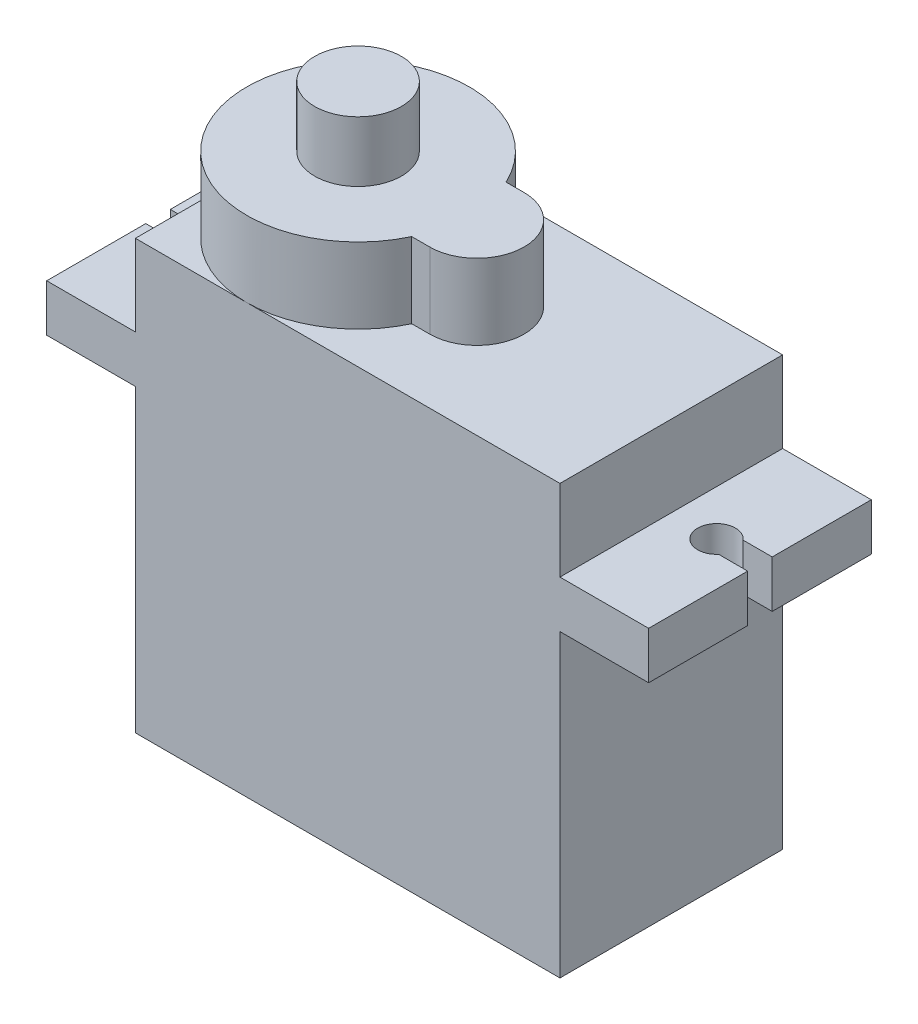
ISO-10303-21;
HEADER;
FILE_DESCRIPTION(('STEP AP214'),'2;1');
FILE_NAME('part.step','',(''),(''),'','','');
FILE_SCHEMA(('AUTOMOTIVE_DESIGN { 1 0 10303 214 1 1 1 1 }'));
ENDSEC;
DATA;
#1=APPLICATION_CONTEXT('core data for automotive mechanical design processes');
#2=APPLICATION_PROTOCOL_DEFINITION('international standard','automotive_design',2000,#1);
#3=PRODUCT_CONTEXT('',#1,'mechanical');
#4=PRODUCT('Part','Part','',(#3));
#5=PRODUCT_RELATED_PRODUCT_CATEGORY('part','',(#4));
#6=PRODUCT_DEFINITION_FORMATION('','',#4);
#7=PRODUCT_DEFINITION_CONTEXT('part definition',#1,'design');
#8=PRODUCT_DEFINITION('design','',#6,#7);
#9=PRODUCT_DEFINITION_SHAPE('','',#8);
#10=(LENGTH_UNIT() NAMED_UNIT(*) SI_UNIT(.MILLI.,.METRE.));
#11=(NAMED_UNIT(*) PLANE_ANGLE_UNIT() SI_UNIT($,.RADIAN.));
#12=(NAMED_UNIT(*) SI_UNIT($,.STERADIAN.) SOLID_ANGLE_UNIT());
#13=UNCERTAINTY_MEASURE_WITH_UNIT(LENGTH_MEASURE(1.E-05),#10,'distance_accuracy_value','');
#14=(GEOMETRIC_REPRESENTATION_CONTEXT(3) GLOBAL_UNCERTAINTY_ASSIGNED_CONTEXT((#13)) GLOBAL_UNIT_ASSIGNED_CONTEXT((#10,
#11,#12)) REPRESENTATION_CONTEXT('',''));
#15=CARTESIAN_POINT('',(0.,0.,0.));
#16=DIRECTION('',(0.,0.,1.));
#17=DIRECTION('',(1.,0.,0.));
#18=AXIS2_PLACEMENT_3D('',#15,#16,#17);
#19=CARTESIAN_POINT('',(0.95,26.7,5.9));
#20=DIRECTION('',(0.,1.,0.));
#21=DIRECTION('',(-1.,0.,0.));
#22=AXIS2_PLACEMENT_3D('',#19,#20,#21);
#23=PLANE('',#22);
#24=CARTESIAN_POINT('',(0.95,26.7,5.9));
#25=DIRECTION('',(0.,1.,0.));
#26=DIRECTION('',(-1.,0.,0.));
#27=AXIS2_PLACEMENT_3D('',#24,#25,#26);
#28=CIRCLE('',#27,2.5);
#29=CARTESIAN_POINT('',(0.949999999999993,26.7,8.4));
#30=VERTEX_POINT('',#29);
#31=CARTESIAN_POINT('',(0.95,26.7,3.4));
#32=VERTEX_POINT('',#31);
#33=EDGE_CURVE('E250',#30,#32,#28,.T.);
#34=ORIENTED_EDGE('',*,*,#33,.T.);
#35=DIRECTION('',(-1.,0.,0.));
#36=VECTOR('',#35,1.);
#37=CARTESIAN_POINT('',(0.95,26.7,3.4));
#38=LINE('',#37,#36);
#39=CARTESIAN_POINT('',(-0.00584431364504856,26.7,3.40000000000001));
#40=VERTEX_POINT('',#39);
#41=EDGE_CURVE('E253',#32,#40,#38,.T.);
#42=ORIENTED_EDGE('',*,*,#41,.T.);
#43=CARTESIAN_POINT('',(-5.35,26.7,5.9));
#44=DIRECTION('',(0.,1.,0.));
#45=DIRECTION('',(-1.,0.,0.));
#46=AXIS2_PLACEMENT_3D('',#43,#44,#45);
#47=CIRCLE('',#46,5.9);
#48=CARTESIAN_POINT('',(-0.00584431364505206,26.7,8.4));
#49=VERTEX_POINT('',#48);
#50=EDGE_CURVE('E256',#40,#49,#47,.T.);
#51=ORIENTED_EDGE('',*,*,#50,.T.);
#52=DIRECTION('',(1.,0.,0.));
#53=VECTOR('',#52,1.);
#54=CARTESIAN_POINT('',(0.949999999999993,26.7,8.4));
#55=LINE('',#54,#53);
#56=EDGE_CURVE('E258',#49,#30,#55,.T.);
#57=ORIENTED_EDGE('',*,*,#56,.T.);
#58=EDGE_LOOP('',(#34,#42,#51,#57));
#59=FACE_BOUND('',#58,.T.);
#60=CARTESIAN_POINT('',(-5.35,26.7,5.9));
#61=DIRECTION('',(0.,1.,0.));
#62=DIRECTION('',(-1.,0.,0.));
#63=AXIS2_PLACEMENT_3D('',#60,#61,#62);
#64=CIRCLE('',#63,2.3);
#65=CARTESIAN_POINT('',(-7.65,26.7,5.9));
#66=VERTEX_POINT('',#65);
#67=EDGE_CURVE('E405',#66,#66,#64,.T.);
#68=ORIENTED_EDGE('',*,*,#67,.F.);
#69=EDGE_LOOP('',(#68));
#70=FACE_BOUND('',#69,.T.);
#71=ADVANCED_FACE('F37',(#59,#70),#23,.T.);
#72=CARTESIAN_POINT('',(15.95,15.9,11.8));
#73=DIRECTION('',(-1.,0.,0.));
#74=DIRECTION('',(0.,-1.,0.));
#75=AXIS2_PLACEMENT_3D('',#72,#73,#74);
#76=PLANE('',#75);
#77=DIRECTION('',(0.,0.,-1.));
#78=VECTOR('',#77,1.);
#79=CARTESIAN_POINT('',(15.95,18.4,11.8));
#80=LINE('',#79,#78);
#81=CARTESIAN_POINT('',(15.95,18.4,5.25));
#82=VERTEX_POINT('',#81);
#83=CARTESIAN_POINT('',(15.95,18.4,0.));
#84=VERTEX_POINT('',#83);
#85=EDGE_CURVE('E372',#82,#84,#80,.T.);
#86=ORIENTED_EDGE('',*,*,#85,.F.);
#87=DIRECTION('',(0.,1.,0.));
#88=VECTOR('',#87,1.);
#89=CARTESIAN_POINT('',(15.95,0.,5.25));
#90=LINE('',#89,#88);
#91=CARTESIAN_POINT('',(15.95,15.9,5.25));
#92=VERTEX_POINT('',#91);
#93=EDGE_CURVE('E400',#92,#82,#90,.T.);
#94=ORIENTED_EDGE('',*,*,#93,.F.);
#95=DIRECTION('',(0.,0.,-1.));
#96=VECTOR('',#95,1.);
#97=CARTESIAN_POINT('',(15.95,15.9,11.8));
#98=LINE('',#97,#96);
#99=CARTESIAN_POINT('',(15.95,15.9,0.));
#100=VERTEX_POINT('',#99);
#101=EDGE_CURVE('E376',#92,#100,#98,.T.);
#102=ORIENTED_EDGE('',*,*,#101,.T.);
#103=DIRECTION('',(0.,1.,0.));
#104=VECTOR('',#103,1.);
#105=CARTESIAN_POINT('',(15.95,15.9,0.));
#106=LINE('',#105,#104);
#107=EDGE_CURVE('E319',#100,#84,#106,.T.);
#108=ORIENTED_EDGE('',*,*,#107,.T.);
#109=EDGE_LOOP('',(#86,#94,#102,#108));
#110=FACE_BOUND('',#109,.T.);
#111=ADVANCED_FACE('F420',(#110),#76,.F.);
#112=CARTESIAN_POINT('',(-15.95,15.9,11.8));
#113=DIRECTION('',(1.,0.,0.));
#114=DIRECTION('',(0.,1.,0.));
#115=AXIS2_PLACEMENT_3D('',#112,#113,#114);
#116=PLANE('',#115);
#117=DIRECTION('',(0.,0.,-1.));
#118=VECTOR('',#117,1.);
#119=CARTESIAN_POINT('',(-15.95,15.9,11.8));
#120=LINE('',#119,#118);
#121=CARTESIAN_POINT('',(-15.95,15.9,5.25000000000001));
#122=VERTEX_POINT('',#121);
#123=CARTESIAN_POINT('',(-15.95,15.9,0.));
#124=VERTEX_POINT('',#123);
#125=EDGE_CURVE('E351',#122,#124,#120,.T.);
#126=ORIENTED_EDGE('',*,*,#125,.F.);
#127=DIRECTION('',(0.,1.,0.));
#128=VECTOR('',#127,1.);
#129=CARTESIAN_POINT('',(-15.95,0.,5.25000000000001));
#130=LINE('',#129,#128);
#131=CARTESIAN_POINT('',(-15.95,18.4,5.25000000000001));
#132=VERTEX_POINT('',#131);
#133=EDGE_CURVE('E233',#122,#132,#130,.T.);
#134=ORIENTED_EDGE('',*,*,#133,.T.);
#135=DIRECTION('',(0.,0.,-1.));
#136=VECTOR('',#135,1.);
#137=CARTESIAN_POINT('',(-15.95,18.4,11.8));
#138=LINE('',#137,#136);
#139=CARTESIAN_POINT('',(-15.95,18.4,0.));
#140=VERTEX_POINT('',#139);
#141=EDGE_CURVE('E355',#132,#140,#138,.T.);
#142=ORIENTED_EDGE('',*,*,#141,.T.);
#143=DIRECTION('',(0.,-1.,0.));
#144=VECTOR('',#143,1.);
#145=CARTESIAN_POINT('',(-15.95,15.9,0.));
#146=LINE('',#145,#144);
#147=EDGE_CURVE('E335',#140,#124,#146,.T.);
#148=ORIENTED_EDGE('',*,*,#147,.T.);
#149=EDGE_LOOP('',(#126,#134,#142,#148));
#150=FACE_BOUND('',#149,.T.);
#151=ADVANCED_FACE('F426',(#150),#116,.F.);
#152=CARTESIAN_POINT('',(11.25,22.7,11.8));
#153=DIRECTION('',(0.,-1.,0.));
#154=DIRECTION('',(1.,0.,0.));
#155=AXIS2_PLACEMENT_3D('',#152,#153,#154);
#156=PLANE('',#155);
#157=CARTESIAN_POINT('',(-5.35,22.7,5.9));
#158=DIRECTION('',(0.,1.,0.));
#159=DIRECTION('',(-1.,0.,0.));
#160=AXIS2_PLACEMENT_3D('',#157,#158,#159);
#161=CIRCLE('',#160,5.9);
#162=CARTESIAN_POINT('',(-11.25,22.7,5.9));
#163=VERTEX_POINT('',#162);
#164=CARTESIAN_POINT('',(-5.35,22.7,11.8));
#165=VERTEX_POINT('',#164);
#166=EDGE_CURVE('E269',#163,#165,#161,.T.);
#167=ORIENTED_EDGE('',*,*,#166,.F.);
#168=DIRECTION('',(0.,0.,-1.));
#169=VECTOR('',#168,1.);
#170=CARTESIAN_POINT('',(-11.25,22.7,11.8));
#171=LINE('',#170,#169);
#172=CARTESIAN_POINT('',(-11.25,22.7,11.8));
#173=VERTEX_POINT('',#172);
#174=EDGE_CURVE('E363',#173,#163,#171,.T.);
#175=ORIENTED_EDGE('',*,*,#174,.F.);
#176=DIRECTION('',(-1.,0.,0.));
#177=VECTOR('',#176,1.);
#178=CARTESIAN_POINT('',(11.25,22.7,11.8));
#179=LINE('',#178,#177);
#180=EDGE_CURVE('E297',#165,#173,#179,.T.);
#181=ORIENTED_EDGE('',*,*,#180,.F.);
#182=EDGE_LOOP('',(#167,#175,#181));
#183=FACE_BOUND('',#182,.T.);
#184=ADVANCED_FACE('F483',(#183),#156,.F.);
#185=CARTESIAN_POINT('',(-0.00584431364505144,22.7,8.4));
#186=VERTEX_POINT('',#185);
#187=EDGE_CURVE('E533',#165,#186,#161,.T.);
#188=ORIENTED_EDGE('',*,*,#187,.F.);
#189=CARTESIAN_POINT('',(11.25,22.7,11.8));
#190=VERTEX_POINT('',#189);
#191=EDGE_CURVE('E298',#190,#165,#179,.T.);
#192=ORIENTED_EDGE('',*,*,#191,.F.);
#193=DIRECTION('',(0.,0.,-1.));
#194=VECTOR('',#193,1.);
#195=CARTESIAN_POINT('',(11.25,22.7,11.8));
#196=LINE('',#195,#194);
#197=CARTESIAN_POINT('',(11.25,22.7,0.));
#198=VERTEX_POINT('',#197);
#199=EDGE_CURVE('E366',#190,#198,#196,.T.);
#200=ORIENTED_EDGE('',*,*,#199,.T.);
#201=DIRECTION('',(-1.,0.,0.));
#202=VECTOR('',#201,1.);
#203=CARTESIAN_POINT('',(11.25,22.7,0.));
#204=LINE('',#203,#202);
#205=CARTESIAN_POINT('',(-5.35,22.7,0.));
#206=VERTEX_POINT('',#205);
#207=EDGE_CURVE('E327',#198,#206,#204,.T.);
#208=ORIENTED_EDGE('',*,*,#207,.T.);
#209=CARTESIAN_POINT('',(-0.00584431364504794,22.7,3.40000000000001));
#210=VERTEX_POINT('',#209);
#211=EDGE_CURVE('E266',#210,#206,#161,.T.);
#212=ORIENTED_EDGE('',*,*,#211,.F.);
#213=DIRECTION('',(-1.,0.,0.));
#214=VECTOR('',#213,1.);
#215=CARTESIAN_POINT('',(0.95,22.7,3.4));
#216=LINE('',#215,#214);
#217=CARTESIAN_POINT('',(0.95,22.7,3.4));
#218=VERTEX_POINT('',#217);
#219=EDGE_CURVE('E263',#218,#210,#216,.T.);
#220=ORIENTED_EDGE('',*,*,#219,.F.);
#221=CARTESIAN_POINT('',(0.95,22.7,5.9));
#222=DIRECTION('',(0.,1.,0.));
#223=DIRECTION('',(-1.,0.,0.));
#224=AXIS2_PLACEMENT_3D('',#221,#222,#223);
#225=CIRCLE('',#224,2.5);
#226=CARTESIAN_POINT('',(0.949999999999993,22.7,8.4));
#227=VERTEX_POINT('',#226);
#228=EDGE_CURVE('E249',#227,#218,#225,.T.);
#229=ORIENTED_EDGE('',*,*,#228,.F.);
#230=DIRECTION('',(1.,0.,0.));
#231=VECTOR('',#230,1.);
#232=CARTESIAN_POINT('',(0.949999999999993,22.7,8.4));
#233=LINE('',#232,#231);
#234=EDGE_CURVE('E254',#186,#227,#233,.T.);
#235=ORIENTED_EDGE('',*,*,#234,.F.);
#236=EDGE_LOOP('',(#188,#192,#200,#208,#212,#220,#229,#235));
#237=FACE_BOUND('',#236,.T.);
#238=ADVANCED_FACE('F486',(#237),#156,.F.);
#239=EDGE_CURVE('E270',#206,#163,#161,.T.);
#240=ORIENTED_EDGE('',*,*,#239,.F.);
#241=CARTESIAN_POINT('',(-11.25,22.7,0.));
#242=VERTEX_POINT('',#241);
#243=EDGE_CURVE('E326',#206,#242,#204,.T.);
#244=ORIENTED_EDGE('',*,*,#243,.T.);
#245=EDGE_CURVE('E362',#163,#242,#171,.T.);
#246=ORIENTED_EDGE('',*,*,#245,.F.);
#247=EDGE_LOOP('',(#240,#244,#246));
#248=FACE_BOUND('',#247,.T.);
#249=ADVANCED_FACE('F488',(#248),#156,.F.);
#250=CARTESIAN_POINT('',(11.25,0.,11.8));
#251=DIRECTION('',(-1.,0.,0.));
#252=DIRECTION('',(0.,0.,1.));
#253=AXIS2_PLACEMENT_3D('',#250,#251,#252);
#254=PLANE('',#253);
#255=DIRECTION('',(0.,1.,0.));
#256=VECTOR('',#255,1.);
#257=CARTESIAN_POINT('',(11.25,0.,0.));
#258=LINE('',#257,#256);
#259=CARTESIAN_POINT('',(11.25,0.,0.));
#260=VERTEX_POINT('',#259);
#261=CARTESIAN_POINT('',(11.25,15.9,0.));
#262=VERTEX_POINT('',#261);
#263=EDGE_CURVE('E284',#260,#262,#258,.T.);
#264=ORIENTED_EDGE('',*,*,#263,.T.);
#265=DIRECTION('',(0.,0.,-1.));
#266=VECTOR('',#265,1.);
#267=CARTESIAN_POINT('',(11.25,15.9,11.8));
#268=LINE('',#267,#266);
#269=CARTESIAN_POINT('',(11.25,15.9,11.8));
#270=VERTEX_POINT('',#269);
#271=EDGE_CURVE('E379',#270,#262,#268,.T.);
#272=ORIENTED_EDGE('',*,*,#271,.F.);
#273=DIRECTION('',(0.,1.,0.));
#274=VECTOR('',#273,1.);
#275=CARTESIAN_POINT('',(11.25,0.,11.8));
#276=LINE('',#275,#274);
#277=CARTESIAN_POINT('',(11.25,0.,11.8));
#278=VERTEX_POINT('',#277);
#279=EDGE_CURVE('E285',#278,#270,#276,.T.);
#280=ORIENTED_EDGE('',*,*,#279,.F.);
#281=DIRECTION('',(0.,0.,-1.));
#282=VECTOR('',#281,1.);
#283=CARTESIAN_POINT('',(11.25,0.,11.8));
#284=LINE('',#283,#282);
#285=EDGE_CURVE('E313',#278,#260,#284,.T.);
#286=ORIENTED_EDGE('',*,*,#285,.T.);
#287=EDGE_LOOP('',(#264,#272,#280,#286));
#288=FACE_BOUND('',#287,.T.);
#289=ADVANCED_FACE('F39',(#288),#254,.F.);
#290=CARTESIAN_POINT('',(11.25,15.9,11.8));
#291=DIRECTION('',(0.,1.,0.));
#292=DIRECTION('',(0.,0.,1.));
#293=AXIS2_PLACEMENT_3D('',#290,#291,#292);
#294=PLANE('',#293);
#295=ORIENTED_EDGE('',*,*,#101,.F.);
#296=DIRECTION('',(-1.,0.,0.));
#297=VECTOR('',#296,1.);
#298=CARTESIAN_POINT('',(11.25,15.9,5.25000000000001));
#299=LINE('',#298,#297);
#300=CARTESIAN_POINT('',(14.4099342076785,15.9,5.25));
#301=VERTEX_POINT('',#300);
#302=EDGE_CURVE('E213',#92,#301,#299,.T.);
#303=ORIENTED_EDGE('',*,*,#302,.T.);
#304=CARTESIAN_POINT('',(13.65,15.9,5.9));
#305=DIRECTION('',(0.,1.,0.));
#306=DIRECTION('',(0.,0.,1.));
#307=AXIS2_PLACEMENT_3D('',#304,#305,#306);
#308=CIRCLE('',#307,0.999999999999998);
#309=CARTESIAN_POINT('',(14.4099342076785,15.9,6.55));
#310=VERTEX_POINT('',#309);
#311=EDGE_CURVE('E219',#301,#310,#308,.T.);
#312=ORIENTED_EDGE('',*,*,#311,.T.);
#313=DIRECTION('',(1.,0.,0.));
#314=VECTOR('',#313,1.);
#315=CARTESIAN_POINT('',(11.25,15.9,6.55));
#316=LINE('',#315,#314);
#317=CARTESIAN_POINT('',(15.95,15.9,6.55));
#318=VERTEX_POINT('',#317);
#319=EDGE_CURVE('E205',#310,#318,#316,.T.);
#320=ORIENTED_EDGE('',*,*,#319,.T.);
#321=CARTESIAN_POINT('',(15.95,15.9,11.8));
#322=VERTEX_POINT('',#321);
#323=EDGE_CURVE('E377',#322,#318,#98,.T.);
#324=ORIENTED_EDGE('',*,*,#323,.F.);
#325=DIRECTION('',(1.,0.,0.));
#326=VECTOR('',#325,1.);
#327=CARTESIAN_POINT('',(11.25,15.9,11.8));
#328=LINE('',#327,#326);
#329=EDGE_CURVE('E288',#270,#322,#328,.T.);
#330=ORIENTED_EDGE('',*,*,#329,.F.);
#331=ORIENTED_EDGE('',*,*,#271,.T.);
#332=DIRECTION('',(1.,0.,0.));
#333=VECTOR('',#332,1.);
#334=CARTESIAN_POINT('',(11.25,15.9,0.));
#335=LINE('',#334,#333);
#336=EDGE_CURVE('E316',#262,#100,#335,.T.);
#337=ORIENTED_EDGE('',*,*,#336,.T.);
#338=EDGE_LOOP('',(#295,#303,#312,#320,#324,#330,#331,#337));
#339=FACE_BOUND('',#338,.T.);
#340=ADVANCED_FACE('F227',(#339),#294,.F.);
#341=ORIENTED_EDGE('',*,*,#323,.T.);
#342=DIRECTION('',(0.,1.,0.));
#343=VECTOR('',#342,1.);
#344=CARTESIAN_POINT('',(15.95,0.,6.55));
#345=LINE('',#344,#343);
#346=CARTESIAN_POINT('',(15.95,18.4,6.55));
#347=VERTEX_POINT('',#346);
#348=EDGE_CURVE('E208',#318,#347,#345,.T.);
#349=ORIENTED_EDGE('',*,*,#348,.T.);
#350=CARTESIAN_POINT('',(15.95,18.4,11.8));
#351=VERTEX_POINT('',#350);
#352=EDGE_CURVE('E373',#351,#347,#80,.T.);
#353=ORIENTED_EDGE('',*,*,#352,.F.);
#354=DIRECTION('',(0.,1.,0.));
#355=VECTOR('',#354,1.);
#356=CARTESIAN_POINT('',(15.95,15.9,11.8));
#357=LINE('',#356,#355);
#358=EDGE_CURVE('E291',#322,#351,#357,.T.);
#359=ORIENTED_EDGE('',*,*,#358,.F.);
#360=EDGE_LOOP('',(#341,#349,#353,#359));
#361=FACE_BOUND('',#360,.T.);
#362=ADVANCED_FACE('F398',(#361),#76,.F.);
#363=CARTESIAN_POINT('',(15.95,18.4,11.8));
#364=DIRECTION('',(0.,-1.,0.));
#365=DIRECTION('',(0.,0.,-1.));
#366=AXIS2_PLACEMENT_3D('',#363,#364,#365);
#367=PLANE('',#366);
#368=CARTESIAN_POINT('',(13.65,18.4,5.9));
#369=DIRECTION('',(0.,-1.,0.));
#370=DIRECTION('',(0.,0.,-1.));
#371=AXIS2_PLACEMENT_3D('',#368,#369,#370);
#372=CIRCLE('',#371,0.999999999999998);
#373=CARTESIAN_POINT('',(14.4099342076785,18.4,6.55));
#374=VERTEX_POINT('',#373);
#375=CARTESIAN_POINT('',(14.4099342076785,18.4,5.25));
#376=VERTEX_POINT('',#375);
#377=EDGE_CURVE('E45',#374,#376,#372,.T.);
#378=ORIENTED_EDGE('',*,*,#377,.T.);
#379=DIRECTION('',(1.,0.,0.));
#380=VECTOR('',#379,1.);
#381=CARTESIAN_POINT('',(15.95,18.4,5.25));
#382=LINE('',#381,#380);
#383=EDGE_CURVE('E11',#376,#82,#382,.T.);
#384=ORIENTED_EDGE('',*,*,#383,.T.);
#385=ORIENTED_EDGE('',*,*,#85,.T.);
#386=DIRECTION('',(-1.,0.,0.));
#387=VECTOR('',#386,1.);
#388=CARTESIAN_POINT('',(15.95,18.4,0.));
#389=LINE('',#388,#387);
#390=CARTESIAN_POINT('',(11.25,18.4,0.));
#391=VERTEX_POINT('',#390);
#392=EDGE_CURVE('E322',#84,#391,#389,.T.);
#393=ORIENTED_EDGE('',*,*,#392,.T.);
#394=DIRECTION('',(0.,0.,-1.));
#395=VECTOR('',#394,1.);
#396=CARTESIAN_POINT('',(11.25,18.4,11.8));
#397=LINE('',#396,#395);
#398=CARTESIAN_POINT('',(11.25,18.4,11.8));
#399=VERTEX_POINT('',#398);
#400=EDGE_CURVE('E369',#399,#391,#397,.T.);
#401=ORIENTED_EDGE('',*,*,#400,.F.);
#402=DIRECTION('',(-1.,0.,0.));
#403=VECTOR('',#402,1.);
#404=CARTESIAN_POINT('',(15.95,18.4,11.8));
#405=LINE('',#404,#403);
#406=EDGE_CURVE('E293',#351,#399,#405,.T.);
#407=ORIENTED_EDGE('',*,*,#406,.F.);
#408=ORIENTED_EDGE('',*,*,#352,.T.);
#409=DIRECTION('',(-1.,0.,0.));
#410=VECTOR('',#409,1.);
#411=CARTESIAN_POINT('',(15.95,18.4,6.55));
#412=LINE('',#411,#410);
#413=EDGE_CURVE('E391',#347,#374,#412,.T.);
#414=ORIENTED_EDGE('',*,*,#413,.T.);
#415=EDGE_LOOP('',(#378,#384,#385,#393,#401,#407,#408,#414));
#416=FACE_BOUND('',#415,.T.);
#417=ADVANCED_FACE('F393',(#416),#367,.F.);
#418=CARTESIAN_POINT('',(11.25,18.4,11.8));
#419=DIRECTION('',(-1.,0.,0.));
#420=DIRECTION('',(0.,-1.,0.));
#421=AXIS2_PLACEMENT_3D('',#418,#419,#420);
#422=PLANE('',#421);
#423=DIRECTION('',(0.,1.,0.));
#424=VECTOR('',#423,1.);
#425=CARTESIAN_POINT('',(11.25,18.4,0.));
#426=LINE('',#425,#424);
#427=EDGE_CURVE('E324',#391,#198,#426,.T.);
#428=ORIENTED_EDGE('',*,*,#427,.T.);
#429=ORIENTED_EDGE('',*,*,#199,.F.);
#430=DIRECTION('',(0.,1.,0.));
#431=VECTOR('',#430,1.);
#432=CARTESIAN_POINT('',(11.25,18.4,11.8));
#433=LINE('',#432,#431);
#434=EDGE_CURVE('E295',#399,#190,#433,.T.);
#435=ORIENTED_EDGE('',*,*,#434,.F.);
#436=ORIENTED_EDGE('',*,*,#400,.T.);
#437=EDGE_LOOP('',(#428,#429,#435,#436));
#438=FACE_BOUND('',#437,.T.);
#439=ADVANCED_FACE('F481',(#438),#422,.F.);
#440=CARTESIAN_POINT('',(-11.25,18.4,11.8));
#441=DIRECTION('',(1.,0.,0.));
#442=DIRECTION('',(0.,1.,0.));
#443=AXIS2_PLACEMENT_3D('',#440,#441,#442);
#444=PLANE('',#443);
#445=DIRECTION('',(0.,-1.,0.));
#446=VECTOR('',#445,1.);
#447=CARTESIAN_POINT('',(-11.25,18.4,0.));
#448=LINE('',#447,#446);
#449=CARTESIAN_POINT('',(-11.25,18.4,0.));
#450=VERTEX_POINT('',#449);
#451=EDGE_CURVE('E330',#242,#450,#448,.T.);
#452=ORIENTED_EDGE('',*,*,#451,.T.);
#453=DIRECTION('',(0.,0.,-1.));
#454=VECTOR('',#453,1.);
#455=CARTESIAN_POINT('',(-11.25,18.4,11.8));
#456=LINE('',#455,#454);
#457=CARTESIAN_POINT('',(-11.25,18.4,11.8));
#458=VERTEX_POINT('',#457);
#459=EDGE_CURVE('E359',#458,#450,#456,.T.);
#460=ORIENTED_EDGE('',*,*,#459,.F.);
#461=DIRECTION('',(0.,-1.,0.));
#462=VECTOR('',#461,1.);
#463=CARTESIAN_POINT('',(-11.25,18.4,11.8));
#464=LINE('',#463,#462);
#465=EDGE_CURVE('E301',#173,#458,#464,.T.);
#466=ORIENTED_EDGE('',*,*,#465,.F.);
#467=ORIENTED_EDGE('',*,*,#174,.T.);
#468=ORIENTED_EDGE('',*,*,#245,.T.);
#469=EDGE_LOOP('',(#452,#460,#466,#467,#468));
#470=FACE_BOUND('',#469,.T.);
#471=ADVANCED_FACE('F477',(#470),#444,.F.);
#472=CARTESIAN_POINT('',(-15.95,18.4,11.8));
#473=DIRECTION('',(0.,-1.,0.));
#474=DIRECTION('',(0.,0.,-1.));
#475=AXIS2_PLACEMENT_3D('',#472,#473,#474);
#476=PLANE('',#475);
#477=ORIENTED_EDGE('',*,*,#141,.F.);
#478=DIRECTION('',(1.,0.,0.));
#479=VECTOR('',#478,1.);
#480=CARTESIAN_POINT('',(-15.95,18.4,5.25000000000001));
#481=LINE('',#480,#479);
#482=CARTESIAN_POINT('',(-14.4099342076785,18.4,5.25000000000001));
#483=VERTEX_POINT('',#482);
#484=EDGE_CURVE('E246',#132,#483,#481,.T.);
#485=ORIENTED_EDGE('',*,*,#484,.T.);
#486=CARTESIAN_POINT('',(-13.65,18.4,5.9));
#487=DIRECTION('',(0.,-1.,0.));
#488=DIRECTION('',(0.,0.,-1.));
#489=AXIS2_PLACEMENT_3D('',#486,#487,#488);
#490=CIRCLE('',#489,0.999999999999999);
#491=CARTESIAN_POINT('',(-14.4099342076785,18.4,6.55));
#492=VERTEX_POINT('',#491);
#493=EDGE_CURVE('E243',#483,#492,#490,.T.);
#494=ORIENTED_EDGE('',*,*,#493,.T.);
#495=DIRECTION('',(-1.,0.,0.));
#496=VECTOR('',#495,1.);
#497=CARTESIAN_POINT('',(-15.95,18.4,6.55));
#498=LINE('',#497,#496);
#499=CARTESIAN_POINT('',(-15.95,18.4,6.55));
#500=VERTEX_POINT('',#499);
#501=EDGE_CURVE('E236',#492,#500,#498,.T.);
#502=ORIENTED_EDGE('',*,*,#501,.T.);
#503=CARTESIAN_POINT('',(-15.95,18.4,11.8));
#504=VERTEX_POINT('',#503);
#505=EDGE_CURVE('E356',#504,#500,#138,.T.);
#506=ORIENTED_EDGE('',*,*,#505,.F.);
#507=DIRECTION('',(-1.,0.,0.));
#508=VECTOR('',#507,1.);
#509=CARTESIAN_POINT('',(-15.95,18.4,11.8));
#510=LINE('',#509,#508);
#511=EDGE_CURVE('E303',#458,#504,#510,.T.);
#512=ORIENTED_EDGE('',*,*,#511,.F.);
#513=ORIENTED_EDGE('',*,*,#459,.T.);
#514=DIRECTION('',(-1.,0.,0.));
#515=VECTOR('',#514,1.);
#516=CARTESIAN_POINT('',(-15.95,18.4,0.));
#517=LINE('',#516,#515);
#518=EDGE_CURVE('E332',#450,#140,#517,.T.);
#519=ORIENTED_EDGE('',*,*,#518,.T.);
#520=EDGE_LOOP('',(#477,#485,#494,#502,#506,#512,#513,#519));
#521=FACE_BOUND('',#520,.T.);
#522=ADVANCED_FACE('F473',(#521),#476,.F.);
#523=ORIENTED_EDGE('',*,*,#505,.T.);
#524=DIRECTION('',(0.,1.,0.));
#525=VECTOR('',#524,1.);
#526=CARTESIAN_POINT('',(-15.95,0.,6.55));
#527=LINE('',#526,#525);
#528=CARTESIAN_POINT('',(-15.95,15.9,6.55));
#529=VERTEX_POINT('',#528);
#530=EDGE_CURVE('E228',#529,#500,#527,.T.);
#531=ORIENTED_EDGE('',*,*,#530,.F.);
#532=CARTESIAN_POINT('',(-15.95,15.9,11.8));
#533=VERTEX_POINT('',#532);
#534=EDGE_CURVE('E352',#533,#529,#120,.T.);
#535=ORIENTED_EDGE('',*,*,#534,.F.);
#536=DIRECTION('',(0.,-1.,0.));
#537=VECTOR('',#536,1.);
#538=CARTESIAN_POINT('',(-15.95,15.9,11.8));
#539=LINE('',#538,#537);
#540=EDGE_CURVE('E305',#504,#533,#539,.T.);
#541=ORIENTED_EDGE('',*,*,#540,.F.);
#542=EDGE_LOOP('',(#523,#531,#535,#541));
#543=FACE_BOUND('',#542,.T.);
#544=ADVANCED_FACE('F469',(#543),#116,.F.);
#545=CARTESIAN_POINT('',(-11.25,15.9,11.8));
#546=DIRECTION('',(0.,1.,0.));
#547=DIRECTION('',(0.,0.,1.));
#548=AXIS2_PLACEMENT_3D('',#545,#546,#547);
#549=PLANE('',#548);
#550=CARTESIAN_POINT('',(-13.65,15.9,5.9));
#551=DIRECTION('',(0.,1.,0.));
#552=DIRECTION('',(0.,0.,1.));
#553=AXIS2_PLACEMENT_3D('',#550,#551,#552);
#554=CIRCLE('',#553,0.999999999999999);
#555=CARTESIAN_POINT('',(-14.4099342076785,15.9,6.55));
#556=VERTEX_POINT('',#555);
#557=CARTESIAN_POINT('',(-14.4099342076785,15.9,5.25000000000001));
#558=VERTEX_POINT('',#557);
#559=EDGE_CURVE('E385',#556,#558,#554,.T.);
#560=ORIENTED_EDGE('',*,*,#559,.T.);
#561=DIRECTION('',(-1.,0.,0.));
#562=VECTOR('',#561,1.);
#563=CARTESIAN_POINT('',(-11.25,15.9,5.25000000000001));
#564=LINE('',#563,#562);
#565=EDGE_CURVE('E388',#558,#122,#564,.T.);
#566=ORIENTED_EDGE('',*,*,#565,.T.);
#567=ORIENTED_EDGE('',*,*,#125,.T.);
#568=DIRECTION('',(1.,0.,0.));
#569=VECTOR('',#568,1.);
#570=CARTESIAN_POINT('',(-11.25,15.9,0.));
#571=LINE('',#570,#569);
#572=CARTESIAN_POINT('',(-11.25,15.9,0.));
#573=VERTEX_POINT('',#572);
#574=EDGE_CURVE('E338',#124,#573,#571,.T.);
#575=ORIENTED_EDGE('',*,*,#574,.T.);
#576=DIRECTION('',(0.,0.,-1.));
#577=VECTOR('',#576,1.);
#578=CARTESIAN_POINT('',(-11.25,15.9,11.8));
#579=LINE('',#578,#577);
#580=CARTESIAN_POINT('',(-11.25,15.9,11.8));
#581=VERTEX_POINT('',#580);
#582=EDGE_CURVE('E348',#581,#573,#579,.T.);
#583=ORIENTED_EDGE('',*,*,#582,.F.);
#584=DIRECTION('',(1.,0.,0.));
#585=VECTOR('',#584,1.);
#586=CARTESIAN_POINT('',(-11.25,15.9,11.8));
#587=LINE('',#586,#585);
#588=EDGE_CURVE('E307',#533,#581,#587,.T.);
#589=ORIENTED_EDGE('',*,*,#588,.F.);
#590=ORIENTED_EDGE('',*,*,#534,.T.);
#591=DIRECTION('',(1.,0.,0.));
#592=VECTOR('',#591,1.);
#593=CARTESIAN_POINT('',(-11.25,15.9,6.55));
#594=LINE('',#593,#592);
#595=EDGE_CURVE('E382',#529,#556,#594,.T.);
#596=ORIENTED_EDGE('',*,*,#595,.T.);
#597=EDGE_LOOP('',(#560,#566,#567,#575,#583,#589,#590,#596));
#598=FACE_BOUND('',#597,.T.);
#599=ADVANCED_FACE('F465',(#598),#549,.F.);
#600=CARTESIAN_POINT('',(-11.25,0.,11.8));
#601=DIRECTION('',(1.,0.,0.));
#602=DIRECTION('',(0.,1.,0.));
#603=AXIS2_PLACEMENT_3D('',#600,#601,#602);
#604=PLANE('',#603);
#605=DIRECTION('',(0.,-1.,0.));
#606=VECTOR('',#605,1.);
#607=CARTESIAN_POINT('',(-11.25,0.,0.));
#608=LINE('',#607,#606);
#609=CARTESIAN_POINT('',(-11.25,0.,0.));
#610=VERTEX_POINT('',#609);
#611=EDGE_CURVE('E340',#573,#610,#608,.T.);
#612=ORIENTED_EDGE('',*,*,#611,.T.);
#613=DIRECTION('',(0.,0.,-1.));
#614=VECTOR('',#613,1.);
#615=CARTESIAN_POINT('',(-11.25,0.,11.8));
#616=LINE('',#615,#614);
#617=CARTESIAN_POINT('',(-11.25,0.,11.8));
#618=VERTEX_POINT('',#617);
#619=EDGE_CURVE('E345',#618,#610,#616,.T.);
#620=ORIENTED_EDGE('',*,*,#619,.F.);
#621=DIRECTION('',(0.,-1.,0.));
#622=VECTOR('',#621,1.);
#623=CARTESIAN_POINT('',(-11.25,0.,11.8));
#624=LINE('',#623,#622);
#625=EDGE_CURVE('E309',#581,#618,#624,.T.);
#626=ORIENTED_EDGE('',*,*,#625,.F.);
#627=ORIENTED_EDGE('',*,*,#582,.T.);
#628=EDGE_LOOP('',(#612,#620,#626,#627));
#629=FACE_BOUND('',#628,.T.);
#630=ADVANCED_FACE('F461',(#629),#604,.F.);
#631=CARTESIAN_POINT('',(-11.25,0.,11.8));
#632=DIRECTION('',(0.,1.,0.));
#633=DIRECTION('',(-1.,0.,0.));
#634=AXIS2_PLACEMENT_3D('',#631,#632,#633);
#635=PLANE('',#634);
#636=DIRECTION('',(1.,0.,0.));
#637=VECTOR('',#636,1.);
#638=CARTESIAN_POINT('',(-11.25,0.,0.));
#639=LINE('',#638,#637);
#640=EDGE_CURVE('E289',#610,#260,#639,.T.);
#641=ORIENTED_EDGE('',*,*,#640,.T.);
#642=ORIENTED_EDGE('',*,*,#285,.F.);
#643=DIRECTION('',(1.,0.,0.));
#644=VECTOR('',#643,1.);
#645=CARTESIAN_POINT('',(-11.25,0.,11.8));
#646=LINE('',#645,#644);
#647=EDGE_CURVE('E311',#618,#278,#646,.T.);
#648=ORIENTED_EDGE('',*,*,#647,.F.);
#649=ORIENTED_EDGE('',*,*,#619,.T.);
#650=EDGE_LOOP('',(#641,#642,#648,#649));
#651=FACE_BOUND('',#650,.T.);
#652=ADVANCED_FACE('F454',(#651),#635,.F.);
#653=CARTESIAN_POINT('',(0.,0.,11.8));
#654=DIRECTION('',(0.,0.,-1.));
#655=DIRECTION('',(-1.,0.,0.));
#656=AXIS2_PLACEMENT_3D('',#653,#654,#655);
#657=PLANE('',#656);
#658=ORIENTED_EDGE('',*,*,#279,.T.);
#659=ORIENTED_EDGE('',*,*,#329,.T.);
#660=ORIENTED_EDGE('',*,*,#358,.T.);
#661=ORIENTED_EDGE('',*,*,#406,.T.);
#662=ORIENTED_EDGE('',*,*,#434,.T.);
#663=ORIENTED_EDGE('',*,*,#191,.T.);
#664=ORIENTED_EDGE('',*,*,#180,.T.);
#665=ORIENTED_EDGE('',*,*,#465,.T.);
#666=ORIENTED_EDGE('',*,*,#511,.T.);
#667=ORIENTED_EDGE('',*,*,#540,.T.);
#668=ORIENTED_EDGE('',*,*,#588,.T.);
#669=ORIENTED_EDGE('',*,*,#625,.T.);
#670=ORIENTED_EDGE('',*,*,#647,.T.);
#671=EDGE_LOOP('',(#658,#659,#660,#661,#662,#663,#664,#665,#666,#667,#668,#669,#670));
#672=FACE_BOUND('',#671,.T.);
#673=ADVANCED_FACE('F451',(#672),#657,.F.);
#674=CARTESIAN_POINT('',(0.,0.,0.));
#675=DIRECTION('',(0.,0.,-1.));
#676=DIRECTION('',(-1.,0.,0.));
#677=AXIS2_PLACEMENT_3D('',#674,#675,#676);
#678=PLANE('',#677);
#679=ORIENTED_EDGE('',*,*,#263,.F.);
#680=ORIENTED_EDGE('',*,*,#640,.F.);
#681=ORIENTED_EDGE('',*,*,#611,.F.);
#682=ORIENTED_EDGE('',*,*,#574,.F.);
#683=ORIENTED_EDGE('',*,*,#147,.F.);
#684=ORIENTED_EDGE('',*,*,#518,.F.);
#685=ORIENTED_EDGE('',*,*,#451,.F.);
#686=ORIENTED_EDGE('',*,*,#243,.F.);
#687=ORIENTED_EDGE('',*,*,#207,.F.);
#688=ORIENTED_EDGE('',*,*,#427,.F.);
#689=ORIENTED_EDGE('',*,*,#392,.F.);
#690=ORIENTED_EDGE('',*,*,#107,.F.);
#691=ORIENTED_EDGE('',*,*,#336,.F.);
#692=EDGE_LOOP('',(#679,#680,#681,#682,#683,#684,#685,#686,#687,#688,#689,#690,#691));
#693=FACE_BOUND('',#692,.T.);
#694=ADVANCED_FACE('F449',(#693),#678,.T.);
#695=CARTESIAN_POINT('',(0.95,26.7,5.9));
#696=DIRECTION('',(0.,-1.,0.));
#697=DIRECTION('',(1.,0.,0.));
#698=AXIS2_PLACEMENT_3D('',#695,#696,#697);
#699=CYLINDRICAL_SURFACE('',#698,2.5);
#700=ORIENTED_EDGE('',*,*,#228,.T.);
#701=DIRECTION('',(0.,-1.,0.));
#702=VECTOR('',#701,1.);
#703=CARTESIAN_POINT('',(0.95,26.7,3.4));
#704=LINE('',#703,#702);
#705=EDGE_CURVE('E281',#32,#218,#704,.T.);
#706=ORIENTED_EDGE('',*,*,#705,.F.);
#707=ORIENTED_EDGE('',*,*,#33,.F.);
#708=DIRECTION('',(0.,-1.,0.));
#709=VECTOR('',#708,1.);
#710=CARTESIAN_POINT('',(0.949999999999993,26.7,8.4));
#711=LINE('',#710,#709);
#712=EDGE_CURVE('E260',#30,#227,#711,.T.);
#713=ORIENTED_EDGE('',*,*,#712,.T.);
#714=EDGE_LOOP('',(#700,#706,#707,#713));
#715=FACE_BOUND('',#714,.T.);
#716=ADVANCED_FACE('F445',(#715),#699,.T.);
#717=CARTESIAN_POINT('',(0.95,26.7,3.4));
#718=DIRECTION('',(0.,0.,1.));
#719=DIRECTION('',(1.,0.,0.));
#720=AXIS2_PLACEMENT_3D('',#717,#718,#719);
#721=PLANE('',#720);
#722=ORIENTED_EDGE('',*,*,#219,.T.);
#723=DIRECTION('',(0.,-1.,0.));
#724=VECTOR('',#723,1.);
#725=CARTESIAN_POINT('',(-0.00584431364504856,26.7,3.40000000000001));
#726=LINE('',#725,#724);
#727=EDGE_CURVE('E278',#40,#210,#726,.T.);
#728=ORIENTED_EDGE('',*,*,#727,.F.);
#729=ORIENTED_EDGE('',*,*,#41,.F.);
#730=ORIENTED_EDGE('',*,*,#705,.T.);
#731=EDGE_LOOP('',(#722,#728,#729,#730));
#732=FACE_BOUND('',#731,.T.);
#733=ADVANCED_FACE('F441',(#732),#721,.F.);
#734=CARTESIAN_POINT('',(-5.35,26.7,5.9));
#735=DIRECTION('',(0.,-1.,0.));
#736=DIRECTION('',(1.,0.,0.));
#737=AXIS2_PLACEMENT_3D('',#734,#735,#736);
#738=CYLINDRICAL_SURFACE('',#737,5.9);
#739=ORIENTED_EDGE('',*,*,#211,.T.);
#740=ORIENTED_EDGE('',*,*,#239,.T.);
#741=ORIENTED_EDGE('',*,*,#166,.T.);
#742=ORIENTED_EDGE('',*,*,#187,.T.);
#743=DIRECTION('',(0.,-1.,0.));
#744=VECTOR('',#743,1.);
#745=CARTESIAN_POINT('',(-0.00584431364505206,26.7,8.4));
#746=LINE('',#745,#744);
#747=EDGE_CURVE('E275',#49,#186,#746,.T.);
#748=ORIENTED_EDGE('',*,*,#747,.F.);
#749=ORIENTED_EDGE('',*,*,#50,.F.);
#750=ORIENTED_EDGE('',*,*,#727,.T.);
#751=EDGE_LOOP('',(#739,#740,#741,#742,#748,#749,#750));
#752=FACE_BOUND('',#751,.T.);
#753=ADVANCED_FACE('F437',(#752),#738,.T.);
#754=CARTESIAN_POINT('',(0.949999999999993,26.7,8.4));
#755=DIRECTION('',(0.,0.,-1.));
#756=DIRECTION('',(-1.,0.,0.));
#757=AXIS2_PLACEMENT_3D('',#754,#755,#756);
#758=PLANE('',#757);
#759=ORIENTED_EDGE('',*,*,#234,.T.);
#760=ORIENTED_EDGE('',*,*,#712,.F.);
#761=ORIENTED_EDGE('',*,*,#56,.F.);
#762=ORIENTED_EDGE('',*,*,#747,.T.);
#763=EDGE_LOOP('',(#759,#760,#761,#762));
#764=FACE_BOUND('',#763,.T.);
#765=ADVANCED_FACE('F433',(#764),#758,.F.);
#766=CARTESIAN_POINT('',(-15.95,0.,5.25000000000001));
#767=DIRECTION('',(0.,0.,-1.));
#768=DIRECTION('',(-1.,0.,0.));
#769=AXIS2_PLACEMENT_3D('',#766,#767,#768);
#770=PLANE('',#769);
#771=ORIENTED_EDGE('',*,*,#133,.F.);
#772=ORIENTED_EDGE('',*,*,#565,.F.);
#773=DIRECTION('',(0.,1.,0.));
#774=VECTOR('',#773,1.);
#775=CARTESIAN_POINT('',(-14.4099342076785,0.,5.25000000000001));
#776=LINE('',#775,#774);
#777=EDGE_CURVE('E237',#558,#483,#776,.T.);
#778=ORIENTED_EDGE('',*,*,#777,.T.);
#779=ORIENTED_EDGE('',*,*,#484,.F.);
#780=EDGE_LOOP('',(#771,#772,#778,#779));
#781=FACE_BOUND('',#780,.T.);
#782=ADVANCED_FACE('F436',(#781),#770,.F.);
#783=CARTESIAN_POINT('',(-13.65,0.,5.9));
#784=DIRECTION('',(0.,1.,0.));
#785=DIRECTION('',(-1.,0.,0.));
#786=AXIS2_PLACEMENT_3D('',#783,#784,#785);
#787=CYLINDRICAL_SURFACE('',#786,0.999999999999999);
#788=ORIENTED_EDGE('',*,*,#777,.F.);
#789=ORIENTED_EDGE('',*,*,#559,.F.);
#790=DIRECTION('',(0.,1.,0.));
#791=VECTOR('',#790,1.);
#792=CARTESIAN_POINT('',(-14.4099342076785,0.,6.55));
#793=LINE('',#792,#791);
#794=EDGE_CURVE('E60',#556,#492,#793,.T.);
#795=ORIENTED_EDGE('',*,*,#794,.T.);
#796=ORIENTED_EDGE('',*,*,#493,.F.);
#797=EDGE_LOOP('',(#788,#789,#795,#796));
#798=FACE_BOUND('',#797,.T.);
#799=ADVANCED_FACE('F563',(#798),#787,.F.);
#800=CARTESIAN_POINT('',(-15.95,0.,6.55));
#801=DIRECTION('',(0.,0.,1.));
#802=DIRECTION('',(1.,0.,0.));
#803=AXIS2_PLACEMENT_3D('',#800,#801,#802);
#804=PLANE('',#803);
#805=ORIENTED_EDGE('',*,*,#794,.F.);
#806=ORIENTED_EDGE('',*,*,#595,.F.);
#807=ORIENTED_EDGE('',*,*,#530,.T.);
#808=ORIENTED_EDGE('',*,*,#501,.F.);
#809=EDGE_LOOP('',(#805,#806,#807,#808));
#810=FACE_BOUND('',#809,.T.);
#811=ADVANCED_FACE('F431',(#810),#804,.F.);
#812=CARTESIAN_POINT('',(13.65,0.,5.9));
#813=DIRECTION('',(0.,1.,0.));
#814=DIRECTION('',(-1.,0.,0.));
#815=AXIS2_PLACEMENT_3D('',#812,#813,#814);
#816=CYLINDRICAL_SURFACE('',#815,0.999999999999998);
#817=DIRECTION('',(0.,1.,0.));
#818=VECTOR('',#817,1.);
#819=CARTESIAN_POINT('',(14.4099342076785,0.,5.25));
#820=LINE('',#819,#818);
#821=EDGE_CURVE('E214',#301,#376,#820,.T.);
#822=ORIENTED_EDGE('',*,*,#821,.T.);
#823=ORIENTED_EDGE('',*,*,#377,.F.);
#824=DIRECTION('',(0.,1.,0.));
#825=VECTOR('',#824,1.);
#826=CARTESIAN_POINT('',(14.4099342076785,0.,6.55));
#827=LINE('',#826,#825);
#828=EDGE_CURVE('E52',#310,#374,#827,.T.);
#829=ORIENTED_EDGE('',*,*,#828,.F.);
#830=ORIENTED_EDGE('',*,*,#311,.F.);
#831=EDGE_LOOP('',(#822,#823,#829,#830));
#832=FACE_BOUND('',#831,.T.);
#833=ADVANCED_FACE('F218',(#832),#816,.F.);
#834=CARTESIAN_POINT('',(15.95,0.,5.25));
#835=DIRECTION('',(0.,0.,-1.));
#836=DIRECTION('',(-1.,0.,0.));
#837=AXIS2_PLACEMENT_3D('',#834,#835,#836);
#838=PLANE('',#837);
#839=ORIENTED_EDGE('',*,*,#93,.T.);
#840=ORIENTED_EDGE('',*,*,#383,.F.);
#841=ORIENTED_EDGE('',*,*,#821,.F.);
#842=ORIENTED_EDGE('',*,*,#302,.F.);
#843=EDGE_LOOP('',(#839,#840,#841,#842));
#844=FACE_BOUND('',#843,.T.);
#845=ADVANCED_FACE('F551',(#844),#838,.F.);
#846=CARTESIAN_POINT('',(15.95,0.,6.55));
#847=DIRECTION('',(0.,0.,1.));
#848=DIRECTION('',(1.,0.,0.));
#849=AXIS2_PLACEMENT_3D('',#846,#847,#848);
#850=PLANE('',#849);
#851=ORIENTED_EDGE('',*,*,#828,.T.);
#852=ORIENTED_EDGE('',*,*,#413,.F.);
#853=ORIENTED_EDGE('',*,*,#348,.F.);
#854=ORIENTED_EDGE('',*,*,#319,.F.);
#855=EDGE_LOOP('',(#851,#852,#853,#854));
#856=FACE_BOUND('',#855,.T.);
#857=ADVANCED_FACE('F206',(#856),#850,.F.);
#858=CARTESIAN_POINT('',(-5.35,29.9,5.9));
#859=DIRECTION('',(0.,-1.,0.));
#860=DIRECTION('',(1.,0.,0.));
#861=AXIS2_PLACEMENT_3D('',#858,#859,#860);
#862=CYLINDRICAL_SURFACE('',#861,2.3);
#863=CARTESIAN_POINT('',(-5.35,29.9,5.9));
#864=DIRECTION('',(0.,1.,0.));
#865=DIRECTION('',(-1.,0.,0.));
#866=AXIS2_PLACEMENT_3D('',#863,#864,#865);
#867=CIRCLE('',#866,2.3);
#868=CARTESIAN_POINT('',(-7.65,29.9,5.9));
#869=VERTEX_POINT('',#868);
#870=EDGE_CURVE('E223',#869,#869,#867,.T.);
#871=ORIENTED_EDGE('',*,*,#870,.F.);
#872=EDGE_LOOP('',(#871));
#873=FACE_BOUND('',#872,.T.);
#874=ORIENTED_EDGE('',*,*,#67,.T.);
#875=EDGE_LOOP('',(#874));
#876=FACE_BOUND('',#875,.T.);
#877=ADVANCED_FACE('F413',(#873,#876),#862,.T.);
#878=CARTESIAN_POINT('',(-5.35,29.9,5.9));
#879=DIRECTION('',(0.,1.,0.));
#880=DIRECTION('',(-1.,0.,0.));
#881=AXIS2_PLACEMENT_3D('',#878,#879,#880);
#882=PLANE('',#881);
#883=ORIENTED_EDGE('',*,*,#870,.T.);
#884=EDGE_LOOP('',(#883));
#885=FACE_BOUND('',#884,.T.);
#886=ADVANCED_FACE('F411',(#885),#882,.T.);
#887=CLOSED_SHELL('',(#71,#111,#151,#184,#238,#249,#289,#340,#362,#417,#439,#471,#522,#544,#599,
#630,#652,#673,#694,#716,#733,#753,#765,#782,#799,#811,#833,#845,#857,#877,#886));
#888=MANIFOLD_SOLID_BREP('B2',#887);
#889=ADVANCED_BREP_SHAPE_REPRESENTATION('',(#18,#888),#14);
#890=SHAPE_DEFINITION_REPRESENTATION(#9,#889);
ENDSEC;
END-ISO-10303-21;
